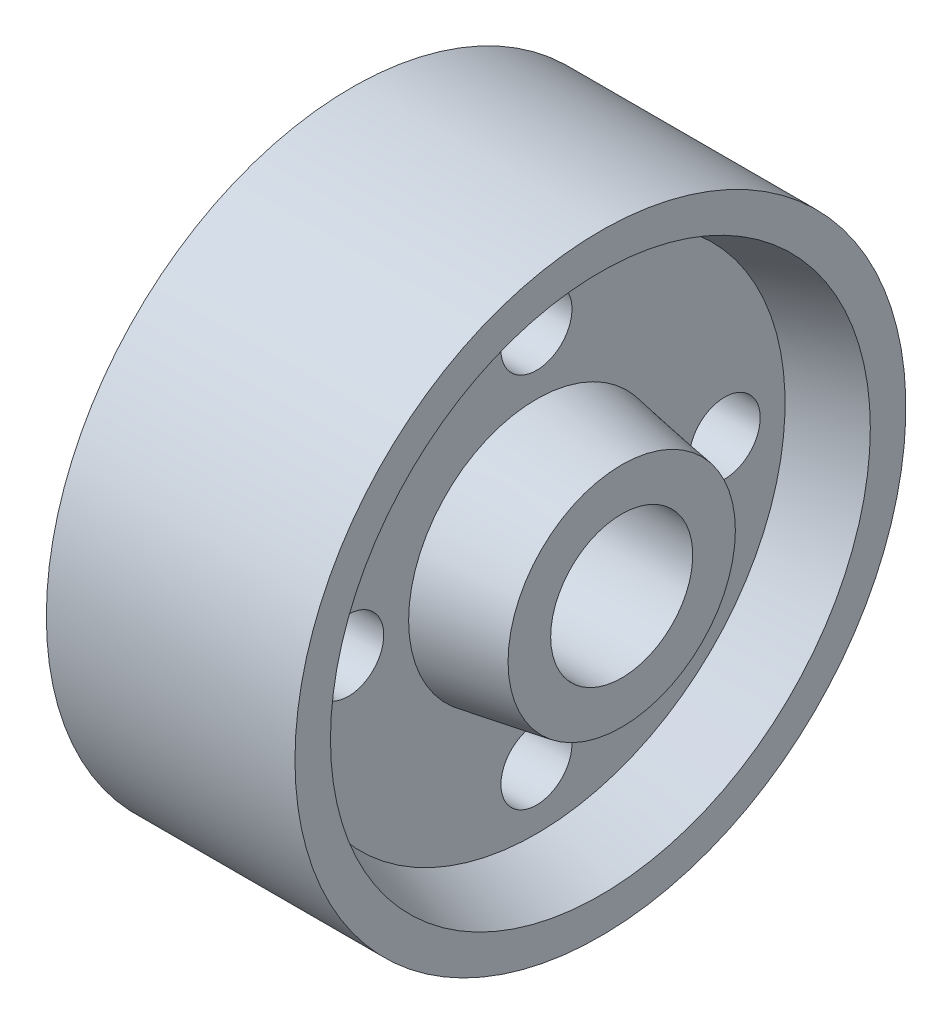
ISO-10303-21;
HEADER;
FILE_DESCRIPTION(('STEP AP214'),'2;1');
FILE_NAME('part.step','',(''),(''),'','','');
FILE_SCHEMA(('AUTOMOTIVE_DESIGN { 1 0 10303 214 1 1 1 1 }'));
ENDSEC;
DATA;
#1=APPLICATION_CONTEXT('core data for automotive mechanical design processes');
#2=APPLICATION_PROTOCOL_DEFINITION('international standard','automotive_design',2000,#1);
#3=PRODUCT_CONTEXT('',#1,'mechanical');
#4=PRODUCT('Part','Part','',(#3));
#5=PRODUCT_RELATED_PRODUCT_CATEGORY('part','',(#4));
#6=PRODUCT_DEFINITION_FORMATION('','',#4);
#7=PRODUCT_DEFINITION_CONTEXT('part definition',#1,'design');
#8=PRODUCT_DEFINITION('design','',#6,#7);
#9=PRODUCT_DEFINITION_SHAPE('','',#8);
#10=(LENGTH_UNIT() NAMED_UNIT(*) SI_UNIT(.MILLI.,.METRE.));
#11=(NAMED_UNIT(*) PLANE_ANGLE_UNIT() SI_UNIT($,.RADIAN.));
#12=(NAMED_UNIT(*) SI_UNIT($,.STERADIAN.) SOLID_ANGLE_UNIT());
#13=UNCERTAINTY_MEASURE_WITH_UNIT(LENGTH_MEASURE(1.E-05),#10,'distance_accuracy_value','');
#14=(GEOMETRIC_REPRESENTATION_CONTEXT(3) GLOBAL_UNCERTAINTY_ASSIGNED_CONTEXT((#13)) GLOBAL_UNIT_ASSIGNED_CONTEXT((#10,
#11,#12)) REPRESENTATION_CONTEXT('',''));
#15=CARTESIAN_POINT('',(0.,0.,0.));
#16=DIRECTION('',(0.,0.,1.));
#17=DIRECTION('',(1.,0.,0.));
#18=AXIS2_PLACEMENT_3D('',#15,#16,#17);
#19=CARTESIAN_POINT('',(41.,0.,0.));
#20=DIRECTION('',(-1.,0.,0.));
#21=DIRECTION('',(0.,0.,1.));
#22=AXIS2_PLACEMENT_3D('',#19,#20,#21);
#23=PLANE('',#22);
#24=CARTESIAN_POINT('',(41.,0.,0.));
#25=DIRECTION('',(-1.,0.,0.));
#26=DIRECTION('',(0.,0.,1.));
#27=AXIS2_PLACEMENT_3D('',#24,#25,#26);
#28=CIRCLE('',#27,10.);
#29=CARTESIAN_POINT('',(41.,0.,10.));
#30=VERTEX_POINT('',#29);
#31=EDGE_CURVE('E59',#30,#30,#28,.T.);
#32=ORIENTED_EDGE('',*,*,#31,.T.);
#33=EDGE_LOOP('',(#32));
#34=FACE_BOUND('',#33,.T.);
#35=CARTESIAN_POINT('',(41.,0.,0.));
#36=DIRECTION('',(-1.,0.,0.));
#37=DIRECTION('',(0.,0.,1.));
#38=AXIS2_PLACEMENT_3D('',#35,#36,#37);
#39=CIRCLE('',#38,16.);
#40=CARTESIAN_POINT('',(41.,0.,16.));
#41=VERTEX_POINT('',#40);
#42=EDGE_CURVE('E10',#41,#41,#39,.T.);
#43=ORIENTED_EDGE('',*,*,#42,.F.);
#44=EDGE_LOOP('',(#43));
#45=FACE_BOUND('',#44,.T.);
#46=ADVANCED_FACE('F39',(#34,#45),#23,.F.);
#47=CARTESIAN_POINT('',(41.,0.,0.));
#48=DIRECTION('',(-1.,0.,0.));
#49=DIRECTION('',(0.,0.,1.));
#50=AXIS2_PLACEMENT_3D('',#47,#48,#49);
#51=CONICAL_SURFACE('',#50,16.,0.165148677414626);
#52=CARTESIAN_POINT('',(29.,0.,0.));
#53=DIRECTION('',(-1.,0.,0.));
#54=DIRECTION('',(0.,0.,1.));
#55=AXIS2_PLACEMENT_3D('',#52,#53,#54);
#56=CIRCLE('',#55,18.);
#57=CARTESIAN_POINT('',(29.,0.,18.));
#58=VERTEX_POINT('',#57);
#59=EDGE_CURVE('E46',#58,#58,#56,.T.);
#60=ORIENTED_EDGE('',*,*,#59,.F.);
#61=EDGE_LOOP('',(#60));
#62=FACE_BOUND('',#61,.T.);
#63=ORIENTED_EDGE('',*,*,#42,.T.);
#64=EDGE_LOOP('',(#63));
#65=FACE_BOUND('',#64,.T.);
#66=ADVANCED_FACE('F108',(#62,#65),#51,.T.);
#67=CARTESIAN_POINT('',(29.,0.,-18.));
#68=DIRECTION('',(-1.,0.,0.));
#69=DIRECTION('',(0.,0.,1.));
#70=AXIS2_PLACEMENT_3D('',#67,#68,#69);
#71=PLANE('',#70);
#72=CARTESIAN_POINT('',(29.,26.5,0.));
#73=DIRECTION('',(-1.,0.,0.));
#74=DIRECTION('',(0.,0.,1.));
#75=AXIS2_PLACEMENT_3D('',#72,#73,#74);
#76=CIRCLE('',#75,5.);
#77=CARTESIAN_POINT('',(29.,26.5,5.));
#78=VERTEX_POINT('',#77);
#79=EDGE_CURVE('E77',#78,#78,#76,.T.);
#80=ORIENTED_EDGE('',*,*,#79,.T.);
#81=EDGE_LOOP('',(#80));
#82=FACE_BOUND('',#81,.T.);
#83=CARTESIAN_POINT('',(29.,0.,26.5));
#84=DIRECTION('',(-1.,0.,0.));
#85=DIRECTION('',(0.,0.,1.));
#86=AXIS2_PLACEMENT_3D('',#83,#84,#85);
#87=CIRCLE('',#86,4.99999999999999);
#88=CARTESIAN_POINT('',(29.,0.,31.5));
#89=VERTEX_POINT('',#88);
#90=EDGE_CURVE('E65',#89,#89,#87,.T.);
#91=ORIENTED_EDGE('',*,*,#90,.T.);
#92=EDGE_LOOP('',(#91));
#93=FACE_BOUND('',#92,.T.);
#94=CARTESIAN_POINT('',(29.,-26.5,0.));
#95=DIRECTION('',(-1.,0.,0.));
#96=DIRECTION('',(0.,0.,1.));
#97=AXIS2_PLACEMENT_3D('',#94,#95,#96);
#98=CIRCLE('',#97,5.);
#99=CARTESIAN_POINT('',(29.,-26.5,5.00000000000001));
#100=VERTEX_POINT('',#99);
#101=EDGE_CURVE('E62',#100,#100,#98,.T.);
#102=ORIENTED_EDGE('',*,*,#101,.T.);
#103=EDGE_LOOP('',(#102));
#104=FACE_BOUND('',#103,.T.);
#105=CARTESIAN_POINT('',(29.,0.,-26.5));
#106=DIRECTION('',(-1.,0.,0.));
#107=DIRECTION('',(0.,0.,1.));
#108=AXIS2_PLACEMENT_3D('',#105,#106,#107);
#109=CIRCLE('',#108,5.);
#110=CARTESIAN_POINT('',(29.,0.,-21.5));
#111=VERTEX_POINT('',#110);
#112=EDGE_CURVE('E58',#111,#111,#109,.T.);
#113=ORIENTED_EDGE('',*,*,#112,.T.);
#114=EDGE_LOOP('',(#113));
#115=FACE_BOUND('',#114,.T.);
#116=CARTESIAN_POINT('',(29.,0.,0.));
#117=DIRECTION('',(-1.,0.,0.));
#118=DIRECTION('',(0.,0.,1.));
#119=AXIS2_PLACEMENT_3D('',#116,#117,#118);
#120=CIRCLE('',#119,35.);
#121=CARTESIAN_POINT('',(29.,0.,35.));
#122=VERTEX_POINT('',#121);
#123=EDGE_CURVE('E51',#122,#122,#120,.T.);
#124=ORIENTED_EDGE('',*,*,#123,.F.);
#125=EDGE_LOOP('',(#124));
#126=FACE_BOUND('',#125,.T.);
#127=ORIENTED_EDGE('',*,*,#59,.T.);
#128=EDGE_LOOP('',(#127));
#129=FACE_BOUND('',#128,.T.);
#130=ADVANCED_FACE('F105',(#82,#93,#104,#115,#126,#129),#71,.F.);
#131=CARTESIAN_POINT('',(29.,0.,0.));
#132=DIRECTION('',(1.,0.,0.));
#133=DIRECTION('',(0.,0.,-1.));
#134=AXIS2_PLACEMENT_3D('',#131,#132,#133);
#135=CONICAL_SURFACE('',#134,35.,0.321750554396642);
#136=CARTESIAN_POINT('',(38.,0.,0.));
#137=DIRECTION('',(-1.,0.,0.));
#138=DIRECTION('',(0.,0.,1.));
#139=AXIS2_PLACEMENT_3D('',#136,#137,#138);
#140=CIRCLE('',#139,38.);
#141=CARTESIAN_POINT('',(38.,0.,38.));
#142=VERTEX_POINT('',#141);
#143=EDGE_CURVE('E98',#142,#142,#140,.T.);
#144=ORIENTED_EDGE('',*,*,#143,.F.);
#145=EDGE_LOOP('',(#144));
#146=FACE_BOUND('',#145,.T.);
#147=ORIENTED_EDGE('',*,*,#123,.T.);
#148=EDGE_LOOP('',(#147));
#149=FACE_BOUND('',#148,.T.);
#150=ADVANCED_FACE('F103',(#146,#149),#135,.F.);
#151=CARTESIAN_POINT('',(38.,0.,-38.));
#152=DIRECTION('',(-1.,0.,0.));
#153=DIRECTION('',(0.,0.,1.));
#154=AXIS2_PLACEMENT_3D('',#151,#152,#153);
#155=PLANE('',#154);
#156=CARTESIAN_POINT('',(38.,0.,0.));
#157=DIRECTION('',(-1.,0.,0.));
#158=DIRECTION('',(0.,0.,1.));
#159=AXIS2_PLACEMENT_3D('',#156,#157,#158);
#160=CIRCLE('',#159,43.);
#161=CARTESIAN_POINT('',(38.,0.,43.));
#162=VERTEX_POINT('',#161);
#163=EDGE_CURVE('E95',#162,#162,#160,.T.);
#164=ORIENTED_EDGE('',*,*,#163,.F.);
#165=EDGE_LOOP('',(#164));
#166=FACE_BOUND('',#165,.T.);
#167=ORIENTED_EDGE('',*,*,#143,.T.);
#168=EDGE_LOOP('',(#167));
#169=FACE_BOUND('',#168,.T.);
#170=ADVANCED_FACE('F121',(#166,#169),#155,.F.);
#171=CARTESIAN_POINT('',(0.,0.,0.));
#172=DIRECTION('',(-1.,0.,0.));
#173=DIRECTION('',(0.,0.,1.));
#174=AXIS2_PLACEMENT_3D('',#171,#172,#173);
#175=CYLINDRICAL_SURFACE('',#174,43.);
#176=CARTESIAN_POINT('',(2.99999999999999,0.,0.));
#177=DIRECTION('',(-1.,0.,0.));
#178=DIRECTION('',(0.,0.,1.));
#179=AXIS2_PLACEMENT_3D('',#176,#177,#178);
#180=CIRCLE('',#179,43.);
#181=CARTESIAN_POINT('',(2.99999999999999,0.,43.));
#182=VERTEX_POINT('',#181);
#183=EDGE_CURVE('E92',#182,#182,#180,.T.);
#184=ORIENTED_EDGE('',*,*,#183,.F.);
#185=EDGE_LOOP('',(#184));
#186=FACE_BOUND('',#185,.T.);
#187=ORIENTED_EDGE('',*,*,#163,.T.);
#188=EDGE_LOOP('',(#187));
#189=FACE_BOUND('',#188,.T.);
#190=ADVANCED_FACE('F125',(#186,#189),#175,.T.);
#191=CARTESIAN_POINT('',(2.99999999999999,0.,-38.));
#192=DIRECTION('',(1.,0.,0.));
#193=DIRECTION('',(0.,0.,-1.));
#194=AXIS2_PLACEMENT_3D('',#191,#192,#193);
#195=PLANE('',#194);
#196=CARTESIAN_POINT('',(2.99999999999999,0.,0.));
#197=DIRECTION('',(-1.,0.,0.));
#198=DIRECTION('',(0.,0.,1.));
#199=AXIS2_PLACEMENT_3D('',#196,#197,#198);
#200=CIRCLE('',#199,38.);
#201=CARTESIAN_POINT('',(2.99999999999999,0.,38.));
#202=VERTEX_POINT('',#201);
#203=EDGE_CURVE('E89',#202,#202,#200,.T.);
#204=ORIENTED_EDGE('',*,*,#203,.F.);
#205=EDGE_LOOP('',(#204));
#206=FACE_BOUND('',#205,.T.);
#207=ORIENTED_EDGE('',*,*,#183,.T.);
#208=EDGE_LOOP('',(#207));
#209=FACE_BOUND('',#208,.T.);
#210=ADVANCED_FACE('F129',(#206,#209),#195,.F.);
#211=CARTESIAN_POINT('',(2.99999999999999,0.,0.));
#212=DIRECTION('',(-1.,0.,0.));
#213=DIRECTION('',(0.,0.,1.));
#214=AXIS2_PLACEMENT_3D('',#211,#212,#213);
#215=CONICAL_SURFACE('',#214,38.,0.321750554396642);
#216=CARTESIAN_POINT('',(12.,0.,0.));
#217=DIRECTION('',(-1.,0.,0.));
#218=DIRECTION('',(0.,0.,1.));
#219=AXIS2_PLACEMENT_3D('',#216,#217,#218);
#220=CIRCLE('',#219,35.);
#221=CARTESIAN_POINT('',(12.,0.,35.));
#222=VERTEX_POINT('',#221);
#223=EDGE_CURVE('E86',#222,#222,#220,.T.);
#224=ORIENTED_EDGE('',*,*,#223,.F.);
#225=EDGE_LOOP('',(#224));
#226=FACE_BOUND('',#225,.T.);
#227=ORIENTED_EDGE('',*,*,#203,.T.);
#228=EDGE_LOOP('',(#227));
#229=FACE_BOUND('',#228,.T.);
#230=ADVANCED_FACE('F133',(#226,#229),#215,.F.);
#231=CARTESIAN_POINT('',(12.,0.,-18.));
#232=DIRECTION('',(1.,0.,0.));
#233=DIRECTION('',(0.,0.,-1.));
#234=AXIS2_PLACEMENT_3D('',#231,#232,#233);
#235=PLANE('',#234);
#236=CARTESIAN_POINT('',(12.,26.5,0.));
#237=DIRECTION('',(1.,0.,0.));
#238=DIRECTION('',(0.,0.,-1.));
#239=AXIS2_PLACEMENT_3D('',#236,#237,#238);
#240=CIRCLE('',#239,5.);
#241=CARTESIAN_POINT('',(12.,26.5,-5.));
#242=VERTEX_POINT('',#241);
#243=EDGE_CURVE('E42',#242,#242,#240,.T.);
#244=ORIENTED_EDGE('',*,*,#243,.T.);
#245=EDGE_LOOP('',(#244));
#246=FACE_BOUND('',#245,.T.);
#247=CARTESIAN_POINT('',(12.,0.,26.5));
#248=DIRECTION('',(1.,0.,0.));
#249=DIRECTION('',(0.,0.,-1.));
#250=AXIS2_PLACEMENT_3D('',#247,#248,#249);
#251=CIRCLE('',#250,4.99999999999999);
#252=CARTESIAN_POINT('',(12.,0.,21.5));
#253=VERTEX_POINT('',#252);
#254=EDGE_CURVE('E63',#253,#253,#251,.T.);
#255=ORIENTED_EDGE('',*,*,#254,.T.);
#256=EDGE_LOOP('',(#255));
#257=FACE_BOUND('',#256,.T.);
#258=CARTESIAN_POINT('',(12.,-26.5,0.));
#259=DIRECTION('',(1.,0.,0.));
#260=DIRECTION('',(0.,0.,-1.));
#261=AXIS2_PLACEMENT_3D('',#258,#259,#260);
#262=CIRCLE('',#261,5.);
#263=CARTESIAN_POINT('',(12.,-26.5,-5.));
#264=VERTEX_POINT('',#263);
#265=EDGE_CURVE('E60',#264,#264,#262,.T.);
#266=ORIENTED_EDGE('',*,*,#265,.T.);
#267=EDGE_LOOP('',(#266));
#268=FACE_BOUND('',#267,.T.);
#269=CARTESIAN_POINT('',(12.,0.,-26.5));
#270=DIRECTION('',(1.,0.,0.));
#271=DIRECTION('',(0.,0.,-1.));
#272=AXIS2_PLACEMENT_3D('',#269,#270,#271);
#273=CIRCLE('',#272,5.);
#274=CARTESIAN_POINT('',(12.,0.,-31.5));
#275=VERTEX_POINT('',#274);
#276=EDGE_CURVE('E55',#275,#275,#273,.T.);
#277=ORIENTED_EDGE('',*,*,#276,.T.);
#278=EDGE_LOOP('',(#277));
#279=FACE_BOUND('',#278,.T.);
#280=CARTESIAN_POINT('',(12.,0.,0.));
#281=DIRECTION('',(-1.,0.,0.));
#282=DIRECTION('',(0.,0.,1.));
#283=AXIS2_PLACEMENT_3D('',#280,#281,#282);
#284=CIRCLE('',#283,18.);
#285=CARTESIAN_POINT('',(12.,0.,18.));
#286=VERTEX_POINT('',#285);
#287=EDGE_CURVE('E83',#286,#286,#284,.T.);
#288=ORIENTED_EDGE('',*,*,#287,.F.);
#289=EDGE_LOOP('',(#288));
#290=FACE_BOUND('',#289,.T.);
#291=ORIENTED_EDGE('',*,*,#223,.T.);
#292=EDGE_LOOP('',(#291));
#293=FACE_BOUND('',#292,.T.);
#294=ADVANCED_FACE('F137',(#246,#257,#268,#279,#290,#293),#235,.F.);
#295=CARTESIAN_POINT('',(12.,0.,0.));
#296=DIRECTION('',(1.,0.,0.));
#297=DIRECTION('',(0.,0.,-1.));
#298=AXIS2_PLACEMENT_3D('',#295,#296,#297);
#299=CONICAL_SURFACE('',#298,18.,0.165148677414627);
#300=CARTESIAN_POINT('',(0.,0.,0.));
#301=DIRECTION('',(-1.,0.,0.));
#302=DIRECTION('',(0.,0.,1.));
#303=AXIS2_PLACEMENT_3D('',#300,#301,#302);
#304=CIRCLE('',#303,16.);
#305=CARTESIAN_POINT('',(0.,0.,16.));
#306=VERTEX_POINT('',#305);
#307=EDGE_CURVE('E80',#306,#306,#304,.T.);
#308=ORIENTED_EDGE('',*,*,#307,.F.);
#309=EDGE_LOOP('',(#308));
#310=FACE_BOUND('',#309,.T.);
#311=ORIENTED_EDGE('',*,*,#287,.T.);
#312=EDGE_LOOP('',(#311));
#313=FACE_BOUND('',#312,.T.);
#314=ADVANCED_FACE('F141',(#310,#313),#299,.T.);
#315=CARTESIAN_POINT('',(0.,0.,0.));
#316=DIRECTION('',(1.,0.,0.));
#317=DIRECTION('',(0.,0.,-1.));
#318=AXIS2_PLACEMENT_3D('',#315,#316,#317);
#319=PLANE('',#318);
#320=CARTESIAN_POINT('',(0.,0.,0.));
#321=DIRECTION('',(-1.,0.,0.));
#322=DIRECTION('',(0.,0.,1.));
#323=AXIS2_PLACEMENT_3D('',#320,#321,#322);
#324=CIRCLE('',#323,10.);
#325=CARTESIAN_POINT('',(0.,0.,10.));
#326=VERTEX_POINT('',#325);
#327=EDGE_CURVE('E176',#326,#326,#324,.T.);
#328=ORIENTED_EDGE('',*,*,#327,.F.);
#329=EDGE_LOOP('',(#328));
#330=FACE_BOUND('',#329,.T.);
#331=ORIENTED_EDGE('',*,*,#307,.T.);
#332=EDGE_LOOP('',(#331));
#333=FACE_BOUND('',#332,.T.);
#334=ADVANCED_FACE('F145',(#330,#333),#319,.F.);
#335=CARTESIAN_POINT('',(41.,0.,-26.5));
#336=DIRECTION('',(-1.,0.,0.));
#337=DIRECTION('',(0.,0.,1.));
#338=AXIS2_PLACEMENT_3D('',#335,#336,#337);
#339=CYLINDRICAL_SURFACE('',#338,5.);
#340=ORIENTED_EDGE('',*,*,#276,.F.);
#341=EDGE_LOOP('',(#340));
#342=FACE_BOUND('',#341,.T.);
#343=ORIENTED_EDGE('',*,*,#112,.F.);
#344=EDGE_LOOP('',(#343));
#345=FACE_BOUND('',#344,.T.);
#346=ADVANCED_FACE('F149',(#342,#345),#339,.F.);
#347=CARTESIAN_POINT('',(41.,-26.5,0.));
#348=DIRECTION('',(-1.,0.,0.));
#349=DIRECTION('',(0.,0.,1.));
#350=AXIS2_PLACEMENT_3D('',#347,#348,#349);
#351=CYLINDRICAL_SURFACE('',#350,5.);
#352=ORIENTED_EDGE('',*,*,#265,.F.);
#353=EDGE_LOOP('',(#352));
#354=FACE_BOUND('',#353,.T.);
#355=ORIENTED_EDGE('',*,*,#101,.F.);
#356=EDGE_LOOP('',(#355));
#357=FACE_BOUND('',#356,.T.);
#358=ADVANCED_FACE('F153',(#354,#357),#351,.F.);
#359=CARTESIAN_POINT('',(41.,0.,26.5));
#360=DIRECTION('',(-1.,0.,0.));
#361=DIRECTION('',(0.,0.,1.));
#362=AXIS2_PLACEMENT_3D('',#359,#360,#361);
#363=CYLINDRICAL_SURFACE('',#362,4.99999999999999);
#364=ORIENTED_EDGE('',*,*,#254,.F.);
#365=EDGE_LOOP('',(#364));
#366=FACE_BOUND('',#365,.T.);
#367=ORIENTED_EDGE('',*,*,#90,.F.);
#368=EDGE_LOOP('',(#367));
#369=FACE_BOUND('',#368,.T.);
#370=ADVANCED_FACE('F157',(#366,#369),#363,.F.);
#371=CARTESIAN_POINT('',(41.,26.5,0.));
#372=DIRECTION('',(-1.,0.,0.));
#373=DIRECTION('',(0.,0.,1.));
#374=AXIS2_PLACEMENT_3D('',#371,#372,#373);
#375=CYLINDRICAL_SURFACE('',#374,5.);
#376=ORIENTED_EDGE('',*,*,#243,.F.);
#377=EDGE_LOOP('',(#376));
#378=FACE_BOUND('',#377,.T.);
#379=ORIENTED_EDGE('',*,*,#79,.F.);
#380=EDGE_LOOP('',(#379));
#381=FACE_BOUND('',#380,.T.);
#382=ADVANCED_FACE('F161',(#378,#381),#375,.F.);
#383=CARTESIAN_POINT('',(41.,0.,0.));
#384=DIRECTION('',(-1.,0.,0.));
#385=DIRECTION('',(0.,0.,1.));
#386=AXIS2_PLACEMENT_3D('',#383,#384,#385);
#387=CYLINDRICAL_SURFACE('',#386,10.);
#388=ORIENTED_EDGE('',*,*,#31,.F.);
#389=EDGE_LOOP('',(#388));
#390=FACE_BOUND('',#389,.T.);
#391=ORIENTED_EDGE('',*,*,#327,.T.);
#392=EDGE_LOOP('',(#391));
#393=FACE_BOUND('',#392,.T.);
#394=ADVANCED_FACE('F165',(#390,#393),#387,.F.);
#395=CLOSED_SHELL('',(#46,#66,#130,#150,#170,#190,#210,#230,#294,#314,#334,#346,#358,#370,#382,#394));
#396=MANIFOLD_SOLID_BREP('B2',#395);
#397=ADVANCED_BREP_SHAPE_REPRESENTATION('',(#18,#396),#14);
#398=SHAPE_DEFINITION_REPRESENTATION(#9,#397);
ENDSEC;
END-ISO-10303-21;
